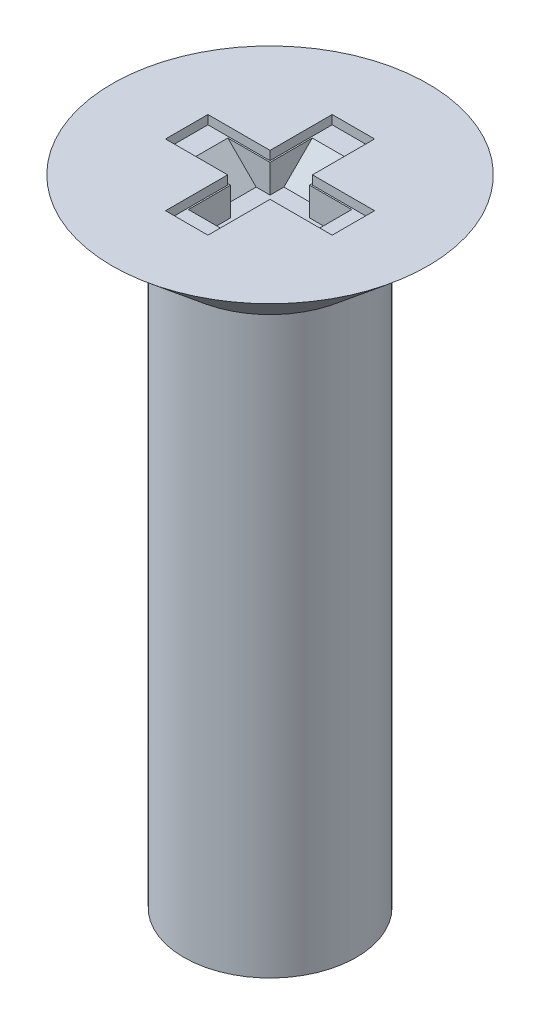
ISO-10303-21;
HEADER;
FILE_DESCRIPTION(('STEP AP214'),'2;1');
FILE_NAME('part.step','',(''),(''),'','','');
FILE_SCHEMA(('AUTOMOTIVE_DESIGN { 1 0 10303 214 1 1 1 1 }'));
ENDSEC;
DATA;
#1=APPLICATION_CONTEXT('core data for automotive mechanical design processes');
#2=APPLICATION_PROTOCOL_DEFINITION('international standard','automotive_design',2000,#1);
#3=PRODUCT_CONTEXT('',#1,'mechanical');
#4=PRODUCT('Part','Part','',(#3));
#5=PRODUCT_RELATED_PRODUCT_CATEGORY('part','',(#4));
#6=PRODUCT_DEFINITION_FORMATION('','',#4);
#7=PRODUCT_DEFINITION_CONTEXT('part definition',#1,'design');
#8=PRODUCT_DEFINITION('design','',#6,#7);
#9=PRODUCT_DEFINITION_SHAPE('','',#8);
#10=(LENGTH_UNIT() NAMED_UNIT(*) SI_UNIT(.MILLI.,.METRE.));
#11=(NAMED_UNIT(*) PLANE_ANGLE_UNIT() SI_UNIT($,.RADIAN.));
#12=(NAMED_UNIT(*) SI_UNIT($,.STERADIAN.) SOLID_ANGLE_UNIT());
#13=UNCERTAINTY_MEASURE_WITH_UNIT(LENGTH_MEASURE(1.E-05),#10,'distance_accuracy_value','');
#14=(GEOMETRIC_REPRESENTATION_CONTEXT(3) GLOBAL_UNCERTAINTY_ASSIGNED_CONTEXT((#13)) GLOBAL_UNIT_ASSIGNED_CONTEXT((#10,
#11,#12)) REPRESENTATION_CONTEXT('',''));
#15=CARTESIAN_POINT('',(0.,0.,0.));
#16=DIRECTION('',(0.,0.,1.));
#17=DIRECTION('',(1.,0.,0.));
#18=AXIS2_PLACEMENT_3D('',#15,#16,#17);
#19=CARTESIAN_POINT('',(-0.58416716291429,0.396610563877362,-0.3429));
#20=DIRECTION('',(0.,-1.,0.));
#21=DIRECTION('',(0.,0.,-1.));
#22=AXIS2_PLACEMENT_3D('',#19,#20,#21);
#23=PLANE('',#22);
#24=DIRECTION('',(1.,0.,0.));
#25=VECTOR('',#24,1.);
#26=CARTESIAN_POINT('',(-0.58416716291429,0.396610563877362,0.3429));
#27=LINE('',#26,#25);
#28=CARTESIAN_POINT('',(-0.584167162914099,0.396610563877425,0.3429));
#29=VERTEX_POINT('',#28);
#30=CARTESIAN_POINT('',(-0.3429,0.396610563877362,0.3429));
#31=VERTEX_POINT('',#30);
#32=EDGE_CURVE('E182',#29,#31,#27,.T.);
#33=ORIENTED_EDGE('',*,*,#32,.T.);
#34=DIRECTION('',(0.,0.,-1.));
#35=VECTOR('',#34,1.);
#36=CARTESIAN_POINT('',(-0.3429,0.396610563877362,0.));
#37=LINE('',#36,#35);
#38=CARTESIAN_POINT('',(-0.3429,0.396610563877362,0.584167162914036));
#39=VERTEX_POINT('',#38);
#40=EDGE_CURVE('E20',#39,#31,#37,.T.);
#41=ORIENTED_EDGE('',*,*,#40,.F.);
#42=DIRECTION('',(1.,0.,0.));
#43=VECTOR('',#42,1.);
#44=CARTESIAN_POINT('',(-0.3429,0.396610563877362,0.584167162914036));
#45=LINE('',#44,#43);
#46=CARTESIAN_POINT('',(0.3429,0.396610563877362,0.584167162914036));
#47=VERTEX_POINT('',#46);
#48=EDGE_CURVE('E179',#39,#47,#45,.T.);
#49=ORIENTED_EDGE('',*,*,#48,.T.);
#50=DIRECTION('',(0.,0.,-1.));
#51=VECTOR('',#50,1.);
#52=CARTESIAN_POINT('',(0.3429,0.396610563877362,-0.3429));
#53=LINE('',#52,#51);
#54=CARTESIAN_POINT('',(0.3429,0.396610563877362,0.3429));
#55=VERTEX_POINT('',#54);
#56=EDGE_CURVE('E194',#47,#55,#53,.T.);
#57=ORIENTED_EDGE('',*,*,#56,.T.);
#58=DIRECTION('',(1.,0.,0.));
#59=VECTOR('',#58,1.);
#60=CARTESIAN_POINT('',(-0.58416716291429,0.396610563877362,0.3429));
#61=LINE('',#60,#59);
#62=CARTESIAN_POINT('',(0.58416716291429,0.396610563877362,0.3429));
#63=VERTEX_POINT('',#62);
#64=EDGE_CURVE('E205',#55,#63,#61,.T.);
#65=ORIENTED_EDGE('',*,*,#64,.T.);
#66=DIRECTION('',(0.,0.,1.));
#67=VECTOR('',#66,1.);
#68=CARTESIAN_POINT('',(0.58416716291429,0.396610563877362,-0.3429));
#69=LINE('',#68,#67);
#70=CARTESIAN_POINT('',(0.58416716291429,0.396610563877362,-0.3429));
#71=VERTEX_POINT('',#70);
#72=EDGE_CURVE('E208',#63,#71,#69,.F.);
#73=ORIENTED_EDGE('',*,*,#72,.T.);
#74=DIRECTION('',(1.,0.,0.));
#75=VECTOR('',#74,1.);
#76=CARTESIAN_POINT('',(0.,0.396610563877362,-0.3429));
#77=LINE('',#76,#75);
#78=CARTESIAN_POINT('',(0.3429,0.396610563877362,-0.3429));
#79=VERTEX_POINT('',#78);
#80=EDGE_CURVE('E209',#79,#71,#77,.T.);
#81=ORIENTED_EDGE('',*,*,#80,.F.);
#82=DIRECTION('',(0.,0.,-1.));
#83=VECTOR('',#82,1.);
#84=CARTESIAN_POINT('',(0.3429,0.396610563877362,-0.3429));
#85=LINE('',#84,#83);
#86=CARTESIAN_POINT('',(0.3429,0.396610563877362,-0.584167162914036));
#87=VERTEX_POINT('',#86);
#88=EDGE_CURVE('E214',#79,#87,#85,.T.);
#89=ORIENTED_EDGE('',*,*,#88,.T.);
#90=DIRECTION('',(-1.,0.,0.));
#91=VECTOR('',#90,1.);
#92=CARTESIAN_POINT('',(-0.3429,0.396610563877362,-0.584167162914036));
#93=LINE('',#92,#91);
#94=CARTESIAN_POINT('',(-0.3429,0.396610563877362,-0.584167162914036));
#95=VERTEX_POINT('',#94);
#96=EDGE_CURVE('E216',#87,#95,#93,.T.);
#97=ORIENTED_EDGE('',*,*,#96,.T.);
#98=DIRECTION('',(0.,0.,-1.));
#99=VECTOR('',#98,1.);
#100=CARTESIAN_POINT('',(-0.3429,0.396610563877362,0.));
#101=LINE('',#100,#99);
#102=CARTESIAN_POINT('',(-0.3429,0.396610563877362,-0.3429));
#103=VERTEX_POINT('',#102);
#104=EDGE_CURVE('E222',#103,#95,#101,.T.);
#105=ORIENTED_EDGE('',*,*,#104,.F.);
#106=DIRECTION('',(1.,0.,0.));
#107=VECTOR('',#106,1.);
#108=CARTESIAN_POINT('',(0.,0.396610563877362,-0.3429));
#109=LINE('',#108,#107);
#110=CARTESIAN_POINT('',(-0.584167162914227,0.396610563877394,-0.3429));
#111=VERTEX_POINT('',#110);
#112=EDGE_CURVE('E224',#111,#103,#109,.T.);
#113=ORIENTED_EDGE('',*,*,#112,.F.);
#114=DIRECTION('',(0.,0.,1.));
#115=VECTOR('',#114,1.);
#116=CARTESIAN_POINT('',(-0.584167162914163,0.396610563877489,-0.3429));
#117=LINE('',#116,#115);
#118=EDGE_CURVE('E227',#111,#29,#117,.T.);
#119=ORIENTED_EDGE('',*,*,#118,.T.);
#120=EDGE_LOOP('',(#33,#41,#49,#57,#65,#73,#81,#89,#97,#105,#113,#119));
#121=FACE_BOUND('',#120,.T.);
#122=ADVANCED_FACE('F17',(#121),#23,.F.);
#123=CARTESIAN_POINT('',(-0.3429,0.,0.));
#124=DIRECTION('',(1.,0.,0.));
#125=DIRECTION('',(0.,0.,-1.));
#126=AXIS2_PLACEMENT_3D('',#123,#124,#125);
#127=PLANE('',#126);
#128=ORIENTED_EDGE('',*,*,#40,.T.);
#129=DIRECTION('',(0.,1.,0.));
#130=VECTOR('',#129,1.);
#131=CARTESIAN_POINT('',(-0.3429,0.,0.3429));
#132=LINE('',#131,#130);
#133=CARTESIAN_POINT('',(-0.3429,0.889,0.3429));
#134=VERTEX_POINT('',#133);
#135=EDGE_CURVE('E185',#31,#134,#132,.T.);
#136=ORIENTED_EDGE('',*,*,#135,.T.);
#137=DIRECTION('',(0.,0.,1.));
#138=VECTOR('',#137,1.);
#139=CARTESIAN_POINT('',(-0.3429,0.889,0.));
#140=LINE('',#139,#138);
#141=CARTESIAN_POINT('',(-0.3429,0.889,1.07655659903667));
#142=VERTEX_POINT('',#141);
#143=EDGE_CURVE('E190',#142,#134,#140,.F.);
#144=ORIENTED_EDGE('',*,*,#143,.F.);
#145=DIRECTION('',(0.,-0.707106781186547,-0.707106781186547));
#146=VECTOR('',#145,1.);
#147=CARTESIAN_POINT('',(-0.3429,0.889,1.07655659903667));
#148=LINE('',#147,#146);
#149=EDGE_CURVE('E187',#142,#39,#148,.T.);
#150=ORIENTED_EDGE('',*,*,#149,.T.);
#151=EDGE_LOOP('',(#128,#136,#144,#150));
#152=FACE_BOUND('',#151,.T.);
#153=ADVANCED_FACE('F188',(#152),#127,.T.);
#154=CARTESIAN_POINT('',(0.,0.,0.3429));
#155=DIRECTION('',(0.,0.,1.));
#156=DIRECTION('',(1.,0.,0.));
#157=AXIS2_PLACEMENT_3D('',#154,#155,#156);
#158=PLANE('',#157);
#159=DIRECTION('',(0.707106781186548,-0.707106781186548,0.));
#160=VECTOR('',#159,1.);
#161=CARTESIAN_POINT('',(-1.2319,1.04434340096333,0.3429));
#162=LINE('',#161,#160);
#163=CARTESIAN_POINT('',(-1.07655659903667,0.889,0.3429));
#164=VERTEX_POINT('',#163);
#165=EDGE_CURVE('E228',#29,#164,#162,.F.);
#166=ORIENTED_EDGE('',*,*,#165,.T.);
#167=DIRECTION('',(1.,0.,0.));
#168=VECTOR('',#167,1.);
#169=CARTESIAN_POINT('',(0.,0.889,0.3429));
#170=LINE('',#169,#168);
#171=EDGE_CURVE('E237',#134,#164,#170,.F.);
#172=ORIENTED_EDGE('',*,*,#171,.F.);
#173=ORIENTED_EDGE('',*,*,#135,.F.);
#174=ORIENTED_EDGE('',*,*,#32,.F.);
#175=EDGE_LOOP('',(#166,#172,#173,#174));
#176=FACE_BOUND('',#175,.T.);
#177=ADVANCED_FACE('F434',(#176),#158,.F.);
#178=CARTESIAN_POINT('',(-1.2319,1.04434340096333,-0.3429));
#179=DIRECTION('',(-0.707106781186548,-0.707106781186548,0.));
#180=DIRECTION('',(0.707106781186548,-0.707106781186548,0.));
#181=AXIS2_PLACEMENT_3D('',#178,#179,#180);
#182=PLANE('',#181);
#183=ORIENTED_EDGE('',*,*,#165,.F.);
#184=ORIENTED_EDGE('',*,*,#118,.F.);
#185=DIRECTION('',(0.707106781186365,-0.70710678118673,0.));
#186=VECTOR('',#185,1.);
#187=CARTESIAN_POINT('',(-1.07655659903667,0.889,-0.3429));
#188=LINE('',#187,#186);
#189=CARTESIAN_POINT('',(-1.07655659903667,0.889,-0.3429));
#190=VERTEX_POINT('',#189);
#191=EDGE_CURVE('E226',#190,#111,#188,.T.);
#192=ORIENTED_EDGE('',*,*,#191,.F.);
#193=DIRECTION('',(0.,0.,1.));
#194=VECTOR('',#193,1.);
#195=CARTESIAN_POINT('',(-1.07655659903667,0.889,0.));
#196=LINE('',#195,#194);
#197=EDGE_CURVE('E240',#164,#190,#196,.F.);
#198=ORIENTED_EDGE('',*,*,#197,.F.);
#199=EDGE_LOOP('',(#183,#184,#192,#198));
#200=FACE_BOUND('',#199,.T.);
#201=ADVANCED_FACE('F400',(#200),#182,.F.);
#202=CARTESIAN_POINT('',(0.,0.,-0.3429));
#203=DIRECTION('',(0.,0.,1.));
#204=DIRECTION('',(1.,0.,0.));
#205=AXIS2_PLACEMENT_3D('',#202,#203,#204);
#206=PLANE('',#205);
#207=ORIENTED_EDGE('',*,*,#112,.T.);
#208=DIRECTION('',(0.,1.,0.));
#209=VECTOR('',#208,1.);
#210=CARTESIAN_POINT('',(-0.3429,0.,-0.3429));
#211=LINE('',#210,#209);
#212=CARTESIAN_POINT('',(-0.3429,0.889,-0.3429));
#213=VERTEX_POINT('',#212);
#214=EDGE_CURVE('E221',#213,#103,#211,.F.);
#215=ORIENTED_EDGE('',*,*,#214,.F.);
#216=DIRECTION('',(1.,0.,0.));
#217=VECTOR('',#216,1.);
#218=CARTESIAN_POINT('',(0.,0.889,-0.3429));
#219=LINE('',#218,#217);
#220=EDGE_CURVE('E380',#190,#213,#219,.T.);
#221=ORIENTED_EDGE('',*,*,#220,.F.);
#222=ORIENTED_EDGE('',*,*,#191,.T.);
#223=EDGE_LOOP('',(#207,#215,#221,#222));
#224=FACE_BOUND('',#223,.T.);
#225=ADVANCED_FACE('F403',(#224),#206,.T.);
#226=CARTESIAN_POINT('',(-0.3429,0.,0.));
#227=DIRECTION('',(1.,0.,0.));
#228=DIRECTION('',(0.,0.,-1.));
#229=AXIS2_PLACEMENT_3D('',#226,#227,#228);
#230=PLANE('',#229);
#231=DIRECTION('',(0.,0.,1.));
#232=VECTOR('',#231,1.);
#233=CARTESIAN_POINT('',(-0.3429,0.889,0.));
#234=LINE('',#233,#232);
#235=CARTESIAN_POINT('',(-0.3429,0.889,-1.07655659903667));
#236=VERTEX_POINT('',#235);
#237=EDGE_CURVE('E377',#213,#236,#234,.F.);
#238=ORIENTED_EDGE('',*,*,#237,.F.);
#239=ORIENTED_EDGE('',*,*,#214,.T.);
#240=ORIENTED_EDGE('',*,*,#104,.T.);
#241=DIRECTION('',(0.,0.707106781186548,-0.707106781186548));
#242=VECTOR('',#241,1.);
#243=CARTESIAN_POINT('',(-0.3429,0.396637928115623,-0.584194527152297));
#244=LINE('',#243,#242);
#245=EDGE_CURVE('E219',#95,#236,#244,.T.);
#246=ORIENTED_EDGE('',*,*,#245,.T.);
#247=EDGE_LOOP('',(#238,#239,#240,#246));
#248=FACE_BOUND('',#247,.T.);
#249=ADVANCED_FACE('F406',(#248),#230,.T.);
#250=CARTESIAN_POINT('',(-0.3429,0.396643400963326,-0.5842));
#251=DIRECTION('',(0.,-0.707106781186548,-0.707106781186548));
#252=DIRECTION('',(0.,0.707106781186548,-0.707106781186548));
#253=AXIS2_PLACEMENT_3D('',#250,#251,#252);
#254=PLANE('',#253);
#255=DIRECTION('',(0.,0.707106781186548,-0.707106781186548));
#256=VECTOR('',#255,1.);
#257=CARTESIAN_POINT('',(0.3429,0.396643400963326,-0.5842));
#258=LINE('',#257,#256);
#259=CARTESIAN_POINT('',(0.3429,0.889,-1.07655659903667));
#260=VERTEX_POINT('',#259);
#261=EDGE_CURVE('E212',#87,#260,#258,.T.);
#262=ORIENTED_EDGE('',*,*,#261,.T.);
#263=DIRECTION('',(1.,0.,0.));
#264=VECTOR('',#263,1.);
#265=CARTESIAN_POINT('',(0.,0.889,-1.07655659903667));
#266=LINE('',#265,#264);
#267=EDGE_CURVE('E374',#236,#260,#266,.T.);
#268=ORIENTED_EDGE('',*,*,#267,.F.);
#269=ORIENTED_EDGE('',*,*,#245,.F.);
#270=ORIENTED_EDGE('',*,*,#96,.F.);
#271=EDGE_LOOP('',(#262,#268,#269,#270));
#272=FACE_BOUND('',#271,.T.);
#273=ADVANCED_FACE('F411',(#272),#254,.F.);
#274=CARTESIAN_POINT('',(0.3429,0.,0.));
#275=DIRECTION('',(1.,0.,0.));
#276=DIRECTION('',(0.,0.,-1.));
#277=AXIS2_PLACEMENT_3D('',#274,#275,#276);
#278=PLANE('',#277);
#279=ORIENTED_EDGE('',*,*,#261,.F.);
#280=ORIENTED_EDGE('',*,*,#88,.F.);
#281=DIRECTION('',(0.,1.,0.));
#282=VECTOR('',#281,1.);
#283=CARTESIAN_POINT('',(0.3429,0.,-0.3429));
#284=LINE('',#283,#282);
#285=CARTESIAN_POINT('',(0.3429,0.889,-0.3429));
#286=VERTEX_POINT('',#285);
#287=EDGE_CURVE('E211',#286,#79,#284,.F.);
#288=ORIENTED_EDGE('',*,*,#287,.F.);
#289=DIRECTION('',(0.,0.,1.));
#290=VECTOR('',#289,1.);
#291=CARTESIAN_POINT('',(0.3429,0.889,0.));
#292=LINE('',#291,#290);
#293=EDGE_CURVE('E367',#260,#286,#292,.T.);
#294=ORIENTED_EDGE('',*,*,#293,.F.);
#295=EDGE_LOOP('',(#279,#280,#288,#294));
#296=FACE_BOUND('',#295,.T.);
#297=ADVANCED_FACE('F416',(#296),#278,.F.);
#298=CARTESIAN_POINT('',(0.,0.,-0.3429));
#299=DIRECTION('',(0.,0.,1.));
#300=DIRECTION('',(1.,0.,0.));
#301=AXIS2_PLACEMENT_3D('',#298,#299,#300);
#302=PLANE('',#301);
#303=DIRECTION('',(1.,0.,0.));
#304=VECTOR('',#303,1.);
#305=CARTESIAN_POINT('',(0.,0.889,-0.3429));
#306=LINE('',#305,#304);
#307=CARTESIAN_POINT('',(1.0765565990368,0.888999999999873,-0.3429));
#308=VERTEX_POINT('',#307);
#309=EDGE_CURVE('E362',#286,#308,#306,.T.);
#310=ORIENTED_EDGE('',*,*,#309,.F.);
#311=ORIENTED_EDGE('',*,*,#287,.T.);
#312=ORIENTED_EDGE('',*,*,#80,.T.);
#313=DIRECTION('',(0.707106781186548,0.707106781186548,0.));
#314=VECTOR('',#313,1.);
#315=CARTESIAN_POINT('',(0.58416716291429,0.396610563877362,-0.3429));
#316=LINE('',#315,#314);
#317=EDGE_CURVE('E355',#71,#308,#316,.T.);
#318=ORIENTED_EDGE('',*,*,#317,.T.);
#319=EDGE_LOOP('',(#310,#311,#312,#318));
#320=FACE_BOUND('',#319,.T.);
#321=ADVANCED_FACE('F419',(#320),#302,.T.);
#322=CARTESIAN_POINT('',(0.58416716291429,0.396610563877362,-0.3429));
#323=DIRECTION('',(0.707106781186548,-0.707106781186548,0.));
#324=DIRECTION('',(0.707106781186548,0.707106781186548,0.));
#325=AXIS2_PLACEMENT_3D('',#322,#323,#324);
#326=PLANE('',#325);
#327=DIRECTION('',(0.707106781186365,0.70710678118673,0.));
#328=VECTOR('',#327,1.);
#329=CARTESIAN_POINT('',(0.58416716291429,0.396610563877362,0.3429));
#330=LINE('',#329,#328);
#331=CARTESIAN_POINT('',(1.07655659903674,0.888999999999937,0.3429));
#332=VERTEX_POINT('',#331);
#333=EDGE_CURVE('E207',#63,#332,#330,.T.);
#334=ORIENTED_EDGE('',*,*,#333,.T.);
#335=DIRECTION('',(0.,0.,1.));
#336=VECTOR('',#335,1.);
#337=CARTESIAN_POINT('',(1.07655659903667,0.889,0.));
#338=LINE('',#337,#336);
#339=EDGE_CURVE('E350',#308,#332,#338,.T.);
#340=ORIENTED_EDGE('',*,*,#339,.F.);
#341=ORIENTED_EDGE('',*,*,#317,.F.);
#342=ORIENTED_EDGE('',*,*,#72,.F.);
#343=EDGE_LOOP('',(#334,#340,#341,#342));
#344=FACE_BOUND('',#343,.T.);
#345=ADVANCED_FACE('F424',(#344),#326,.F.);
#346=CARTESIAN_POINT('',(0.,0.,0.3429));
#347=DIRECTION('',(0.,0.,1.));
#348=DIRECTION('',(1.,0.,0.));
#349=AXIS2_PLACEMENT_3D('',#346,#347,#348);
#350=PLANE('',#349);
#351=ORIENTED_EDGE('',*,*,#333,.F.);
#352=ORIENTED_EDGE('',*,*,#64,.F.);
#353=DIRECTION('',(0.,1.,0.));
#354=VECTOR('',#353,1.);
#355=CARTESIAN_POINT('',(0.3429,0.,0.3429));
#356=LINE('',#355,#354);
#357=CARTESIAN_POINT('',(0.3429,0.889,0.3429));
#358=VERTEX_POINT('',#357);
#359=EDGE_CURVE('E204',#55,#358,#356,.T.);
#360=ORIENTED_EDGE('',*,*,#359,.T.);
#361=DIRECTION('',(1.,0.,0.));
#362=VECTOR('',#361,1.);
#363=CARTESIAN_POINT('',(0.,0.889,0.3429));
#364=LINE('',#363,#362);
#365=EDGE_CURVE('E339',#332,#358,#364,.F.);
#366=ORIENTED_EDGE('',*,*,#365,.F.);
#367=EDGE_LOOP('',(#351,#352,#360,#366));
#368=FACE_BOUND('',#367,.T.);
#369=ADVANCED_FACE('F428',(#368),#350,.F.);
#370=CARTESIAN_POINT('',(0.3429,0.,0.));
#371=DIRECTION('',(1.,0.,0.));
#372=DIRECTION('',(0.,0.,-1.));
#373=AXIS2_PLACEMENT_3D('',#370,#371,#372);
#374=PLANE('',#373);
#375=DIRECTION('',(0.,0.707106781186548,0.707106781186547));
#376=VECTOR('',#375,1.);
#377=CARTESIAN_POINT('',(0.3429,0.396637928115623,0.584194527152297));
#378=LINE('',#377,#376);
#379=CARTESIAN_POINT('',(0.3429,0.889,1.07655659903667));
#380=VERTEX_POINT('',#379);
#381=EDGE_CURVE('E198',#47,#380,#378,.T.);
#382=ORIENTED_EDGE('',*,*,#381,.T.);
#383=DIRECTION('',(0.,0.,1.));
#384=VECTOR('',#383,1.);
#385=CARTESIAN_POINT('',(0.3429,0.889,0.));
#386=LINE('',#385,#384);
#387=EDGE_CURVE('E336',#358,#380,#386,.T.);
#388=ORIENTED_EDGE('',*,*,#387,.F.);
#389=ORIENTED_EDGE('',*,*,#359,.F.);
#390=ORIENTED_EDGE('',*,*,#56,.F.);
#391=EDGE_LOOP('',(#382,#388,#389,#390));
#392=FACE_BOUND('',#391,.T.);
#393=ADVANCED_FACE('F432',(#392),#374,.F.);
#394=CARTESIAN_POINT('',(-0.3429,1.04434340096333,1.2319));
#395=DIRECTION('',(0.,-0.707106781186548,0.707106781186548));
#396=DIRECTION('',(0.,-0.707106781186548,-0.707106781186548));
#397=AXIS2_PLACEMENT_3D('',#394,#395,#396);
#398=PLANE('',#397);
#399=ORIENTED_EDGE('',*,*,#381,.F.);
#400=ORIENTED_EDGE('',*,*,#48,.F.);
#401=ORIENTED_EDGE('',*,*,#149,.F.);
#402=DIRECTION('',(1.,0.,0.));
#403=VECTOR('',#402,1.);
#404=CARTESIAN_POINT('',(0.,0.889,1.07655659903667));
#405=LINE('',#404,#403);
#406=EDGE_CURVE('E334',#380,#142,#405,.F.);
#407=ORIENTED_EDGE('',*,*,#406,.F.);
#408=EDGE_LOOP('',(#399,#400,#401,#407));
#409=FACE_BOUND('',#408,.T.);
#410=ADVANCED_FACE('F197',(#409),#398,.F.);
#411=CARTESIAN_POINT('',(0.,0.889,0.));
#412=DIRECTION('',(0.,1.,0.));
#413=DIRECTION('',(0.,0.,1.));
#414=AXIS2_PLACEMENT_3D('',#411,#412,#413);
#415=PLANE('',#414);
#416=ORIENTED_EDGE('',*,*,#387,.T.);
#417=ORIENTED_EDGE('',*,*,#406,.T.);
#418=ORIENTED_EDGE('',*,*,#143,.T.);
#419=ORIENTED_EDGE('',*,*,#171,.T.);
#420=ORIENTED_EDGE('',*,*,#197,.T.);
#421=ORIENTED_EDGE('',*,*,#220,.T.);
#422=ORIENTED_EDGE('',*,*,#237,.T.);
#423=ORIENTED_EDGE('',*,*,#267,.T.);
#424=ORIENTED_EDGE('',*,*,#293,.T.);
#425=ORIENTED_EDGE('',*,*,#309,.T.);
#426=ORIENTED_EDGE('',*,*,#339,.T.);
#427=ORIENTED_EDGE('',*,*,#365,.T.);
#428=EDGE_LOOP('',(#416,#417,#418,#419,#420,#421,#422,#423,#424,#425,#426,#427));
#429=FACE_BOUND('',#428,.T.);
#430=DIRECTION('',(-1.,0.,0.));
#431=VECTOR('',#430,1.);
#432=CARTESIAN_POINT('',(0.3683,0.889,-1.4478));
#433=LINE('',#432,#431);
#434=CARTESIAN_POINT('',(0.3683,0.889,-1.4478));
#435=VERTEX_POINT('',#434);
#436=CARTESIAN_POINT('',(-0.3683,0.889,-1.4478));
#437=VERTEX_POINT('',#436);
#438=EDGE_CURVE('E332',#435,#437,#433,.T.);
#439=ORIENTED_EDGE('',*,*,#438,.T.);
#440=DIRECTION('',(0.,0.,1.));
#441=VECTOR('',#440,1.);
#442=CARTESIAN_POINT('',(-0.3683,0.889,-1.4478));
#443=LINE('',#442,#441);
#444=CARTESIAN_POINT('',(-0.3683,0.889,-0.3683));
#445=VERTEX_POINT('',#444);
#446=EDGE_CURVE('E287',#437,#445,#443,.T.);
#447=ORIENTED_EDGE('',*,*,#446,.T.);
#448=DIRECTION('',(-1.,0.,0.));
#449=VECTOR('',#448,1.);
#450=CARTESIAN_POINT('',(-0.3683,0.889,-0.3683));
#451=LINE('',#450,#449);
#452=CARTESIAN_POINT('',(-1.4478,0.889,-0.3683));
#453=VERTEX_POINT('',#452);
#454=EDGE_CURVE('E294',#445,#453,#451,.T.);
#455=ORIENTED_EDGE('',*,*,#454,.T.);
#456=DIRECTION('',(0.,0.,1.));
#457=VECTOR('',#456,1.);
#458=CARTESIAN_POINT('',(-1.4478,0.889,-0.3683));
#459=LINE('',#458,#457);
#460=CARTESIAN_POINT('',(-1.4478,0.889,0.3683));
#461=VERTEX_POINT('',#460);
#462=EDGE_CURVE('E298',#453,#461,#459,.T.);
#463=ORIENTED_EDGE('',*,*,#462,.T.);
#464=DIRECTION('',(1.,0.,0.));
#465=VECTOR('',#464,1.);
#466=CARTESIAN_POINT('',(-1.4478,0.889,0.3683));
#467=LINE('',#466,#465);
#468=CARTESIAN_POINT('',(-0.3683,0.889,0.3683));
#469=VERTEX_POINT('',#468);
#470=EDGE_CURVE('E302',#461,#469,#467,.T.);
#471=ORIENTED_EDGE('',*,*,#470,.T.);
#472=DIRECTION('',(0.,0.,1.));
#473=VECTOR('',#472,1.);
#474=CARTESIAN_POINT('',(-0.3683,0.889,0.3683));
#475=LINE('',#474,#473);
#476=CARTESIAN_POINT('',(-0.3683,0.889,1.4478));
#477=VERTEX_POINT('',#476);
#478=EDGE_CURVE('E306',#469,#477,#475,.T.);
#479=ORIENTED_EDGE('',*,*,#478,.T.);
#480=DIRECTION('',(1.,0.,0.));
#481=VECTOR('',#480,1.);
#482=CARTESIAN_POINT('',(-0.3683,0.889,1.4478));
#483=LINE('',#482,#481);
#484=CARTESIAN_POINT('',(0.3683,0.889,1.4478));
#485=VERTEX_POINT('',#484);
#486=EDGE_CURVE('E310',#477,#485,#483,.T.);
#487=ORIENTED_EDGE('',*,*,#486,.T.);
#488=DIRECTION('',(0.,0.,-1.));
#489=VECTOR('',#488,1.);
#490=CARTESIAN_POINT('',(0.3683,0.889,1.4478));
#491=LINE('',#490,#489);
#492=CARTESIAN_POINT('',(0.3683,0.889,0.3683));
#493=VERTEX_POINT('',#492);
#494=EDGE_CURVE('E314',#485,#493,#491,.T.);
#495=ORIENTED_EDGE('',*,*,#494,.T.);
#496=DIRECTION('',(1.,0.,0.));
#497=VECTOR('',#496,1.);
#498=CARTESIAN_POINT('',(0.3683,0.889,0.3683));
#499=LINE('',#498,#497);
#500=CARTESIAN_POINT('',(1.4478,0.889,0.3683));
#501=VERTEX_POINT('',#500);
#502=EDGE_CURVE('E318',#493,#501,#499,.T.);
#503=ORIENTED_EDGE('',*,*,#502,.T.);
#504=DIRECTION('',(0.,0.,-1.));
#505=VECTOR('',#504,1.);
#506=CARTESIAN_POINT('',(1.4478,0.889,0.3683));
#507=LINE('',#506,#505);
#508=CARTESIAN_POINT('',(1.4478,0.889,-0.3683));
#509=VERTEX_POINT('',#508);
#510=EDGE_CURVE('E322',#501,#509,#507,.T.);
#511=ORIENTED_EDGE('',*,*,#510,.T.);
#512=DIRECTION('',(-1.,0.,0.));
#513=VECTOR('',#512,1.);
#514=CARTESIAN_POINT('',(1.4478,0.889,-0.3683));
#515=LINE('',#514,#513);
#516=CARTESIAN_POINT('',(0.3683,0.889,-0.3683));
#517=VERTEX_POINT('',#516);
#518=EDGE_CURVE('E326',#509,#517,#515,.T.);
#519=ORIENTED_EDGE('',*,*,#518,.T.);
#520=DIRECTION('',(0.,0.,-1.));
#521=VECTOR('',#520,1.);
#522=CARTESIAN_POINT('',(0.3683,0.889,-0.3683));
#523=LINE('',#522,#521);
#524=EDGE_CURVE('E330',#517,#435,#523,.T.);
#525=ORIENTED_EDGE('',*,*,#524,.T.);
#526=EDGE_LOOP('',(#439,#447,#455,#463,#471,#479,#487,#495,#503,#511,#519,#525));
#527=FACE_BOUND('',#526,.T.);
#528=ADVANCED_FACE('F395',(#429,#527),#415,.T.);
#529=CARTESIAN_POINT('',(0.3683,2.921,-1.4478));
#530=DIRECTION('',(0.,0.,-1.));
#531=DIRECTION('',(-1.,0.,0.));
#532=AXIS2_PLACEMENT_3D('',#529,#530,#531);
#533=PLANE('',#532);
#534=ORIENTED_EDGE('',*,*,#438,.F.);
#535=DIRECTION('',(0.,1.,0.));
#536=VECTOR('',#535,1.);
#537=CARTESIAN_POINT('',(0.3683,2.921,-1.4478));
#538=LINE('',#537,#536);
#539=CARTESIAN_POINT('',(0.3683,1.04434340096333,-1.4478));
#540=VERTEX_POINT('',#539);
#541=EDGE_CURVE('E328',#435,#540,#538,.T.);
#542=ORIENTED_EDGE('',*,*,#541,.T.);
#543=DIRECTION('',(1.,0.,0.));
#544=VECTOR('',#543,1.);
#545=CARTESIAN_POINT('',(0.,1.04434340096333,-1.4478));
#546=LINE('',#545,#544);
#547=CARTESIAN_POINT('',(-0.3683,1.04434340096333,-1.4478));
#548=VERTEX_POINT('',#547);
#549=EDGE_CURVE('E284',#548,#540,#546,.T.);
#550=ORIENTED_EDGE('',*,*,#549,.F.);
#551=DIRECTION('',(0.,1.,0.));
#552=VECTOR('',#551,1.);
#553=CARTESIAN_POINT('',(-0.3683,2.921,-1.4478));
#554=LINE('',#553,#552);
#555=EDGE_CURVE('E289',#548,#437,#554,.F.);
#556=ORIENTED_EDGE('',*,*,#555,.T.);
#557=EDGE_LOOP('',(#534,#542,#550,#556));
#558=FACE_BOUND('',#557,.T.);
#559=ADVANCED_FACE('F503',(#558),#533,.F.);
#560=CARTESIAN_POINT('',(0.3683,2.921,-0.3683));
#561=DIRECTION('',(1.,0.,0.));
#562=DIRECTION('',(0.,0.,-1.));
#563=AXIS2_PLACEMENT_3D('',#560,#561,#562);
#564=PLANE('',#563);
#565=ORIENTED_EDGE('',*,*,#524,.F.);
#566=DIRECTION('',(0.,1.,0.));
#567=VECTOR('',#566,1.);
#568=CARTESIAN_POINT('',(0.3683,2.921,-0.3683));
#569=LINE('',#568,#567);
#570=CARTESIAN_POINT('',(0.3683,1.04434340096333,-0.3683));
#571=VERTEX_POINT('',#570);
#572=EDGE_CURVE('E324',#517,#571,#569,.T.);
#573=ORIENTED_EDGE('',*,*,#572,.T.);
#574=DIRECTION('',(0.,0.,1.));
#575=VECTOR('',#574,1.);
#576=CARTESIAN_POINT('',(0.3683,1.04434340096333,0.));
#577=LINE('',#576,#575);
#578=EDGE_CURVE('E281',#540,#571,#577,.T.);
#579=ORIENTED_EDGE('',*,*,#578,.F.);
#580=ORIENTED_EDGE('',*,*,#541,.F.);
#581=EDGE_LOOP('',(#565,#573,#579,#580));
#582=FACE_BOUND('',#581,.T.);
#583=ADVANCED_FACE('F499',(#582),#564,.F.);
#584=CARTESIAN_POINT('',(1.4478,2.921,-0.3683));
#585=DIRECTION('',(0.,0.,-1.));
#586=DIRECTION('',(-1.,0.,0.));
#587=AXIS2_PLACEMENT_3D('',#584,#585,#586);
#588=PLANE('',#587);
#589=ORIENTED_EDGE('',*,*,#518,.F.);
#590=DIRECTION('',(0.,1.,0.));
#591=VECTOR('',#590,1.);
#592=CARTESIAN_POINT('',(1.4478,2.921,-0.3683));
#593=LINE('',#592,#591);
#594=CARTESIAN_POINT('',(1.4478,1.04434340096333,-0.3683));
#595=VERTEX_POINT('',#594);
#596=EDGE_CURVE('E320',#509,#595,#593,.T.);
#597=ORIENTED_EDGE('',*,*,#596,.T.);
#598=DIRECTION('',(1.,0.,0.));
#599=VECTOR('',#598,1.);
#600=CARTESIAN_POINT('',(0.,1.04434340096333,-0.3683));
#601=LINE('',#600,#599);
#602=EDGE_CURVE('E278',#571,#595,#601,.T.);
#603=ORIENTED_EDGE('',*,*,#602,.F.);
#604=ORIENTED_EDGE('',*,*,#572,.F.);
#605=EDGE_LOOP('',(#589,#597,#603,#604));
#606=FACE_BOUND('',#605,.T.);
#607=ADVANCED_FACE('F495',(#606),#588,.F.);
#608=CARTESIAN_POINT('',(1.4478,2.921,0.3683));
#609=DIRECTION('',(1.,0.,0.));
#610=DIRECTION('',(0.,0.,-1.));
#611=AXIS2_PLACEMENT_3D('',#608,#609,#610);
#612=PLANE('',#611);
#613=ORIENTED_EDGE('',*,*,#510,.F.);
#614=DIRECTION('',(0.,1.,0.));
#615=VECTOR('',#614,1.);
#616=CARTESIAN_POINT('',(1.4478,2.921,0.3683));
#617=LINE('',#616,#615);
#618=CARTESIAN_POINT('',(1.4478,1.04434340096333,0.3683));
#619=VERTEX_POINT('',#618);
#620=EDGE_CURVE('E316',#501,#619,#617,.T.);
#621=ORIENTED_EDGE('',*,*,#620,.T.);
#622=DIRECTION('',(0.,0.,1.));
#623=VECTOR('',#622,1.);
#624=CARTESIAN_POINT('',(1.4478,1.04434340096333,0.));
#625=LINE('',#624,#623);
#626=EDGE_CURVE('E275',#595,#619,#625,.T.);
#627=ORIENTED_EDGE('',*,*,#626,.F.);
#628=ORIENTED_EDGE('',*,*,#596,.F.);
#629=EDGE_LOOP('',(#613,#621,#627,#628));
#630=FACE_BOUND('',#629,.T.);
#631=ADVANCED_FACE('F491',(#630),#612,.F.);
#632=CARTESIAN_POINT('',(0.3683,2.921,0.3683));
#633=DIRECTION('',(0.,0.,1.));
#634=DIRECTION('',(1.,0.,0.));
#635=AXIS2_PLACEMENT_3D('',#632,#633,#634);
#636=PLANE('',#635);
#637=ORIENTED_EDGE('',*,*,#502,.F.);
#638=DIRECTION('',(0.,1.,0.));
#639=VECTOR('',#638,1.);
#640=CARTESIAN_POINT('',(0.3683,2.921,0.3683));
#641=LINE('',#640,#639);
#642=CARTESIAN_POINT('',(0.3683,1.04434340096333,0.3683));
#643=VERTEX_POINT('',#642);
#644=EDGE_CURVE('E312',#493,#643,#641,.T.);
#645=ORIENTED_EDGE('',*,*,#644,.T.);
#646=DIRECTION('',(1.,0.,0.));
#647=VECTOR('',#646,1.);
#648=CARTESIAN_POINT('',(0.,1.04434340096333,0.3683));
#649=LINE('',#648,#647);
#650=EDGE_CURVE('E272',#619,#643,#649,.F.);
#651=ORIENTED_EDGE('',*,*,#650,.F.);
#652=ORIENTED_EDGE('',*,*,#620,.F.);
#653=EDGE_LOOP('',(#637,#645,#651,#652));
#654=FACE_BOUND('',#653,.T.);
#655=ADVANCED_FACE('F487',(#654),#636,.F.);
#656=CARTESIAN_POINT('',(0.3683,2.921,1.4478));
#657=DIRECTION('',(1.,0.,0.));
#658=DIRECTION('',(0.,0.,-1.));
#659=AXIS2_PLACEMENT_3D('',#656,#657,#658);
#660=PLANE('',#659);
#661=ORIENTED_EDGE('',*,*,#494,.F.);
#662=DIRECTION('',(0.,1.,0.));
#663=VECTOR('',#662,1.);
#664=CARTESIAN_POINT('',(0.3683,2.921,1.4478));
#665=LINE('',#664,#663);
#666=CARTESIAN_POINT('',(0.3683,1.04434340096333,1.4478));
#667=VERTEX_POINT('',#666);
#668=EDGE_CURVE('E308',#485,#667,#665,.T.);
#669=ORIENTED_EDGE('',*,*,#668,.T.);
#670=DIRECTION('',(0.,0.,1.));
#671=VECTOR('',#670,1.);
#672=CARTESIAN_POINT('',(0.3683,1.04434340096333,0.));
#673=LINE('',#672,#671);
#674=EDGE_CURVE('E269',#643,#667,#673,.T.);
#675=ORIENTED_EDGE('',*,*,#674,.F.);
#676=ORIENTED_EDGE('',*,*,#644,.F.);
#677=EDGE_LOOP('',(#661,#669,#675,#676));
#678=FACE_BOUND('',#677,.T.);
#679=ADVANCED_FACE('F483',(#678),#660,.F.);
#680=CARTESIAN_POINT('',(-0.3683,2.921,1.4478));
#681=DIRECTION('',(0.,0.,1.));
#682=DIRECTION('',(1.,0.,0.));
#683=AXIS2_PLACEMENT_3D('',#680,#681,#682);
#684=PLANE('',#683);
#685=ORIENTED_EDGE('',*,*,#486,.F.);
#686=DIRECTION('',(0.,1.,0.));
#687=VECTOR('',#686,1.);
#688=CARTESIAN_POINT('',(-0.3683,2.921,1.4478));
#689=LINE('',#688,#687);
#690=CARTESIAN_POINT('',(-0.3683,1.04434340096333,1.4478));
#691=VERTEX_POINT('',#690);
#692=EDGE_CURVE('E304',#477,#691,#689,.T.);
#693=ORIENTED_EDGE('',*,*,#692,.T.);
#694=DIRECTION('',(1.,0.,0.));
#695=VECTOR('',#694,1.);
#696=CARTESIAN_POINT('',(0.,1.04434340096333,1.4478));
#697=LINE('',#696,#695);
#698=EDGE_CURVE('E266',#667,#691,#697,.F.);
#699=ORIENTED_EDGE('',*,*,#698,.F.);
#700=ORIENTED_EDGE('',*,*,#668,.F.);
#701=EDGE_LOOP('',(#685,#693,#699,#700));
#702=FACE_BOUND('',#701,.T.);
#703=ADVANCED_FACE('F479',(#702),#684,.F.);
#704=CARTESIAN_POINT('',(-0.3683,2.921,0.3683));
#705=DIRECTION('',(-1.,0.,0.));
#706=DIRECTION('',(0.,0.,1.));
#707=AXIS2_PLACEMENT_3D('',#704,#705,#706);
#708=PLANE('',#707);
#709=ORIENTED_EDGE('',*,*,#478,.F.);
#710=DIRECTION('',(0.,1.,0.));
#711=VECTOR('',#710,1.);
#712=CARTESIAN_POINT('',(-0.3683,2.921,0.3683));
#713=LINE('',#712,#711);
#714=CARTESIAN_POINT('',(-0.3683,1.04434340096333,0.3683));
#715=VERTEX_POINT('',#714);
#716=EDGE_CURVE('E300',#469,#715,#713,.T.);
#717=ORIENTED_EDGE('',*,*,#716,.T.);
#718=DIRECTION('',(0.,0.,1.));
#719=VECTOR('',#718,1.);
#720=CARTESIAN_POINT('',(-0.3683,1.04434340096333,0.));
#721=LINE('',#720,#719);
#722=EDGE_CURVE('E263',#691,#715,#721,.F.);
#723=ORIENTED_EDGE('',*,*,#722,.F.);
#724=ORIENTED_EDGE('',*,*,#692,.F.);
#725=EDGE_LOOP('',(#709,#717,#723,#724));
#726=FACE_BOUND('',#725,.T.);
#727=ADVANCED_FACE('F475',(#726),#708,.F.);
#728=CARTESIAN_POINT('',(-1.4478,2.921,0.3683));
#729=DIRECTION('',(0.,0.,1.));
#730=DIRECTION('',(1.,0.,0.));
#731=AXIS2_PLACEMENT_3D('',#728,#729,#730);
#732=PLANE('',#731);
#733=ORIENTED_EDGE('',*,*,#470,.F.);
#734=DIRECTION('',(0.,1.,0.));
#735=VECTOR('',#734,1.);
#736=CARTESIAN_POINT('',(-1.4478,2.921,0.3683));
#737=LINE('',#736,#735);
#738=CARTESIAN_POINT('',(-1.4478,1.04434340096333,0.3683));
#739=VERTEX_POINT('',#738);
#740=EDGE_CURVE('E296',#461,#739,#737,.T.);
#741=ORIENTED_EDGE('',*,*,#740,.T.);
#742=DIRECTION('',(1.,0.,0.));
#743=VECTOR('',#742,1.);
#744=CARTESIAN_POINT('',(0.,1.04434340096333,0.3683));
#745=LINE('',#744,#743);
#746=EDGE_CURVE('E260',#715,#739,#745,.F.);
#747=ORIENTED_EDGE('',*,*,#746,.F.);
#748=ORIENTED_EDGE('',*,*,#716,.F.);
#749=EDGE_LOOP('',(#733,#741,#747,#748));
#750=FACE_BOUND('',#749,.T.);
#751=ADVANCED_FACE('F471',(#750),#732,.F.);
#752=CARTESIAN_POINT('',(-1.4478,2.921,-0.3683));
#753=DIRECTION('',(-1.,0.,0.));
#754=DIRECTION('',(0.,0.,1.));
#755=AXIS2_PLACEMENT_3D('',#752,#753,#754);
#756=PLANE('',#755);
#757=ORIENTED_EDGE('',*,*,#462,.F.);
#758=DIRECTION('',(0.,1.,0.));
#759=VECTOR('',#758,1.);
#760=CARTESIAN_POINT('',(-1.4478,2.921,-0.3683));
#761=LINE('',#760,#759);
#762=CARTESIAN_POINT('',(-1.4478,1.04434340096333,-0.3683));
#763=VERTEX_POINT('',#762);
#764=EDGE_CURVE('E292',#453,#763,#761,.T.);
#765=ORIENTED_EDGE('',*,*,#764,.T.);
#766=DIRECTION('',(0.,0.,1.));
#767=VECTOR('',#766,1.);
#768=CARTESIAN_POINT('',(-1.4478,1.04434340096333,0.));
#769=LINE('',#768,#767);
#770=EDGE_CURVE('E255',#739,#763,#769,.F.);
#771=ORIENTED_EDGE('',*,*,#770,.F.);
#772=ORIENTED_EDGE('',*,*,#740,.F.);
#773=EDGE_LOOP('',(#757,#765,#771,#772));
#774=FACE_BOUND('',#773,.T.);
#775=ADVANCED_FACE('F468',(#774),#756,.F.);
#776=CARTESIAN_POINT('',(-0.3683,2.921,-0.3683));
#777=DIRECTION('',(0.,0.,-1.));
#778=DIRECTION('',(-1.,0.,0.));
#779=AXIS2_PLACEMENT_3D('',#776,#777,#778);
#780=PLANE('',#779);
#781=ORIENTED_EDGE('',*,*,#454,.F.);
#782=DIRECTION('',(0.,1.,0.));
#783=VECTOR('',#782,1.);
#784=CARTESIAN_POINT('',(-0.3683,2.921,-0.3683));
#785=LINE('',#784,#783);
#786=CARTESIAN_POINT('',(-0.3683,1.04434340096333,-0.3683));
#787=VERTEX_POINT('',#786);
#788=EDGE_CURVE('E35',#445,#787,#785,.T.);
#789=ORIENTED_EDGE('',*,*,#788,.T.);
#790=DIRECTION('',(1.,0.,0.));
#791=VECTOR('',#790,1.);
#792=CARTESIAN_POINT('',(0.,1.04434340096333,-0.3683));
#793=LINE('',#792,#791);
#794=EDGE_CURVE('E250',#763,#787,#793,.T.);
#795=ORIENTED_EDGE('',*,*,#794,.F.);
#796=ORIENTED_EDGE('',*,*,#764,.F.);
#797=EDGE_LOOP('',(#781,#789,#795,#796));
#798=FACE_BOUND('',#797,.T.);
#799=ADVANCED_FACE('F464',(#798),#780,.F.);
#800=CARTESIAN_POINT('',(-0.3683,2.921,-1.4478));
#801=DIRECTION('',(-1.,0.,0.));
#802=DIRECTION('',(0.,0.,1.));
#803=AXIS2_PLACEMENT_3D('',#800,#801,#802);
#804=PLANE('',#803);
#805=ORIENTED_EDGE('',*,*,#446,.F.);
#806=ORIENTED_EDGE('',*,*,#555,.F.);
#807=DIRECTION('',(0.,0.,1.));
#808=VECTOR('',#807,1.);
#809=CARTESIAN_POINT('',(-0.3683,1.04434340096333,0.));
#810=LINE('',#809,#808);
#811=EDGE_CURVE('E246',#787,#548,#810,.F.);
#812=ORIENTED_EDGE('',*,*,#811,.F.);
#813=ORIENTED_EDGE('',*,*,#788,.F.);
#814=EDGE_LOOP('',(#805,#806,#812,#813));
#815=FACE_BOUND('',#814,.T.);
#816=ADVANCED_FACE('F461',(#815),#804,.F.);
#817=CARTESIAN_POINT('',(0.,1.04434340096333,0.));
#818=DIRECTION('',(0.,1.,0.));
#819=DIRECTION('',(0.,0.,1.));
#820=AXIS2_PLACEMENT_3D('',#817,#818,#819);
#821=PLANE('',#820);
#822=ORIENTED_EDGE('',*,*,#794,.T.);
#823=ORIENTED_EDGE('',*,*,#811,.T.);
#824=ORIENTED_EDGE('',*,*,#549,.T.);
#825=ORIENTED_EDGE('',*,*,#578,.T.);
#826=ORIENTED_EDGE('',*,*,#602,.T.);
#827=ORIENTED_EDGE('',*,*,#626,.T.);
#828=ORIENTED_EDGE('',*,*,#650,.T.);
#829=ORIENTED_EDGE('',*,*,#674,.T.);
#830=ORIENTED_EDGE('',*,*,#698,.T.);
#831=ORIENTED_EDGE('',*,*,#722,.T.);
#832=ORIENTED_EDGE('',*,*,#746,.T.);
#833=ORIENTED_EDGE('',*,*,#770,.T.);
#834=EDGE_LOOP('',(#822,#823,#824,#825,#826,#827,#828,#829,#830,#831,#832,#833));
#835=FACE_BOUND('',#834,.T.);
#836=CARTESIAN_POINT('',(0.,1.04434340105844,0.));
#837=DIRECTION('',(0.,1.,0.));
#838=DIRECTION('',(0.,0.,1.));
#839=AXIS2_PLACEMENT_3D('',#836,#837,#838);
#840=CIRCLE('',#839,2.74320000005446);
#841=CARTESIAN_POINT('',(0.,1.04434340105844,2.74320000005446));
#842=VERTEX_POINT('',#841);
#843=EDGE_CURVE('E244',#842,#842,#840,.F.);
#844=ORIENTED_EDGE('',*,*,#843,.F.);
#845=EDGE_LOOP('',(#844));
#846=FACE_BOUND('',#845,.T.);
#847=ADVANCED_FACE('F457',(#835,#846),#821,.T.);
#848=CARTESIAN_POINT('',(0.,-9.9822,0.));
#849=DIRECTION('',(0.,1.,0.));
#850=DIRECTION('',(0.,0.,1.));
#851=AXIS2_PLACEMENT_3D('',#848,#849,#850);
#852=PLANE('',#851);
#853=CARTESIAN_POINT('',(0.,-9.9822,0.));
#854=DIRECTION('',(0.,1.,0.));
#855=DIRECTION('',(0.,0.,1.));
#856=AXIS2_PLACEMENT_3D('',#853,#854,#855);
#857=CIRCLE('',#856,1.4986);
#858=CARTESIAN_POINT('',(0.,-9.9822,1.4986));
#859=VERTEX_POINT('',#858);
#860=EDGE_CURVE('E26',#859,#859,#857,.T.);
#861=ORIENTED_EDGE('',*,*,#860,.F.);
#862=EDGE_LOOP('',(#861));
#863=FACE_BOUND('',#862,.T.);
#864=ADVANCED_FACE('F451',(#863),#852,.F.);
#865=CARTESIAN_POINT('',(0.,1.04434340096304,0.));
#866=DIRECTION('',(0.,1.,0.));
#867=DIRECTION('',(0.,0.,1.));
#868=AXIS2_PLACEMENT_3D('',#865,#866,#867);
#869=CONICAL_SURFACE('',#868,2.74319999994077,0.87266462596884);
#870=ORIENTED_EDGE('',*,*,#843,.T.);
#871=EDGE_LOOP('',(#870));
#872=FACE_BOUND('',#871,.T.);
#873=CARTESIAN_POINT('',(0.,0.,0.));
#874=DIRECTION('',(0.,1.,0.));
#875=DIRECTION('',(0.,0.,1.));
#876=AXIS2_PLACEMENT_3D('',#873,#874,#875);
#877=CIRCLE('',#876,1.4986);
#878=CARTESIAN_POINT('',(0.,0.,1.4986));
#879=VERTEX_POINT('',#878);
#880=EDGE_CURVE('E11',#879,#879,#877,.F.);
#881=ORIENTED_EDGE('',*,*,#880,.F.);
#882=EDGE_LOOP('',(#881));
#883=FACE_BOUND('',#882,.T.);
#884=ADVANCED_FACE('F445',(#872,#883),#869,.T.);
#885=CARTESIAN_POINT('',(0.,0.,0.));
#886=DIRECTION('',(0.,1.,0.));
#887=DIRECTION('',(0.,0.,1.));
#888=AXIS2_PLACEMENT_3D('',#885,#886,#887);
#889=CYLINDRICAL_SURFACE('',#888,1.4986);
#890=ORIENTED_EDGE('',*,*,#860,.T.);
#891=EDGE_LOOP('',(#890));
#892=FACE_BOUND('',#891,.T.);
#893=ORIENTED_EDGE('',*,*,#880,.T.);
#894=EDGE_LOOP('',(#893));
#895=FACE_BOUND('',#894,.T.);
#896=ADVANCED_FACE('F443',(#892,#895),#889,.T.);
#897=CLOSED_SHELL('',(#122,#153,#177,#201,#225,#249,#273,#297,#321,#345,#369,#393,#410,#528,
#559,#583,#607,#631,#655,#679,#703,#727,#751,#775,#799,#816,#847,#864,#884,#896));
#898=MANIFOLD_SOLID_BREP('B1',#897);
#899=ADVANCED_BREP_SHAPE_REPRESENTATION('',(#18,#898),#14);
#900=SHAPE_DEFINITION_REPRESENTATION(#9,#899);
ENDSEC;
END-ISO-10303-21;
